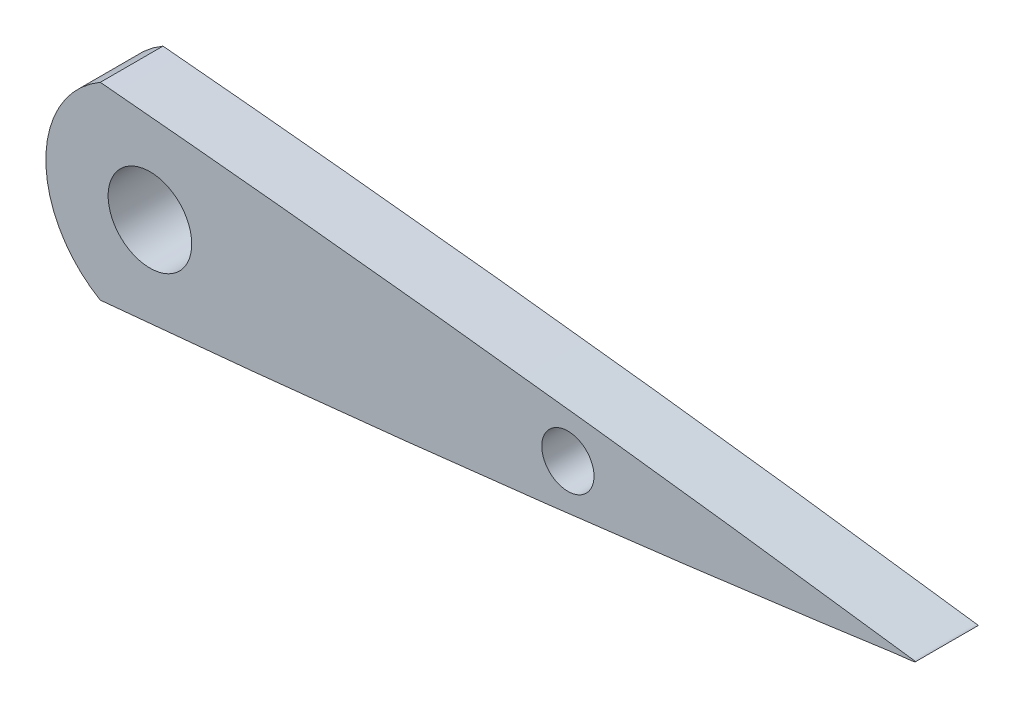
ISO-10303-21;
HEADER;
FILE_DESCRIPTION(('STEP AP214'),'2;1');
FILE_NAME('part.step','',(''),(''),'','','');
FILE_SCHEMA(('AUTOMOTIVE_DESIGN { 1 0 10303 214 1 1 1 1 }'));
ENDSEC;
DATA;
#1=APPLICATION_CONTEXT('core data for automotive mechanical design processes');
#2=APPLICATION_PROTOCOL_DEFINITION('international standard','automotive_design',2000,#1);
#3=PRODUCT_CONTEXT('',#1,'mechanical');
#4=PRODUCT('Part','Part','',(#3));
#5=PRODUCT_RELATED_PRODUCT_CATEGORY('part','',(#4));
#6=PRODUCT_DEFINITION_FORMATION('','',#4);
#7=PRODUCT_DEFINITION_CONTEXT('part definition',#1,'design');
#8=PRODUCT_DEFINITION('design','',#6,#7);
#9=PRODUCT_DEFINITION_SHAPE('','',#8);
#10=(LENGTH_UNIT() NAMED_UNIT(*) SI_UNIT(.MILLI.,.METRE.));
#11=(NAMED_UNIT(*) PLANE_ANGLE_UNIT() SI_UNIT($,.RADIAN.));
#12=(NAMED_UNIT(*) SI_UNIT($,.STERADIAN.) SOLID_ANGLE_UNIT());
#13=UNCERTAINTY_MEASURE_WITH_UNIT(LENGTH_MEASURE(1.E-05),#10,'distance_accuracy_value','');
#14=(GEOMETRIC_REPRESENTATION_CONTEXT(3) GLOBAL_UNCERTAINTY_ASSIGNED_CONTEXT((#13)) GLOBAL_UNIT_ASSIGNED_CONTEXT((#10,
#11,#12)) REPRESENTATION_CONTEXT('',''));
#15=CARTESIAN_POINT('',(0.,0.,0.));
#16=DIRECTION('',(0.,0.,1.));
#17=DIRECTION('',(1.,0.,0.));
#18=AXIS2_PLACEMENT_3D('',#15,#16,#17);
#19=CARTESIAN_POINT('',(152.202991408779,0.,6.));
#20=DIRECTION('',(0.,0.,-1.));
#21=DIRECTION('',(-1.,0.,0.));
#22=AXIS2_PLACEMENT_3D('',#19,#20,#21);
#23=CYLINDRICAL_SURFACE('',#22,10.4259828175577);
#24=CARTESIAN_POINT('',(152.202991408779,0.,0.));
#25=DIRECTION('',(0.,0.,1.));
#26=DIRECTION('',(1.,0.,0.));
#27=AXIS2_PLACEMENT_3D('',#24,#25,#26);
#28=CIRCLE('',#27,10.4259828175577);
#29=CARTESIAN_POINT('',(146.99,9.02916597942501,0.));
#30=VERTEX_POINT('',#29);
#31=CARTESIAN_POINT('',(146.99,-9.02916597942503,0.));
#32=VERTEX_POINT('',#31);
#33=EDGE_CURVE('E67',#30,#32,#28,.T.);
#34=ORIENTED_EDGE('',*,*,#33,.T.);
#35=DIRECTION('',(0.,0.,-1.));
#36=VECTOR('',#35,1.);
#37=CARTESIAN_POINT('',(146.99,-9.02916597942503,6.));
#38=LINE('',#37,#36);
#39=CARTESIAN_POINT('',(146.99,-9.02916597942503,6.));
#40=VERTEX_POINT('',#39);
#41=EDGE_CURVE('E11',#40,#32,#38,.T.);
#42=ORIENTED_EDGE('',*,*,#41,.F.);
#43=CARTESIAN_POINT('',(152.202991408779,0.,6.));
#44=DIRECTION('',(0.,0.,1.));
#45=DIRECTION('',(1.,0.,0.));
#46=AXIS2_PLACEMENT_3D('',#43,#44,#45);
#47=CIRCLE('',#46,10.4259828175577);
#48=CARTESIAN_POINT('',(146.99,9.02916597942501,6.));
#49=VERTEX_POINT('',#48);
#50=EDGE_CURVE('E70',#49,#40,#47,.T.);
#51=ORIENTED_EDGE('',*,*,#50,.F.);
#52=DIRECTION('',(0.,0.,-1.));
#53=VECTOR('',#52,1.);
#54=CARTESIAN_POINT('',(146.99,9.02916597942501,6.));
#55=LINE('',#54,#53);
#56=EDGE_CURVE('E44',#49,#30,#55,.T.);
#57=ORIENTED_EDGE('',*,*,#56,.T.);
#58=EDGE_LOOP('',(#34,#42,#51,#57));
#59=FACE_BOUND('',#58,.T.);
#60=ADVANCED_FACE('F35',(#59),#23,.T.);
#61=CARTESIAN_POINT('',(191.74,0.,6.));
#62=DIRECTION('',(0.,0.,-1.));
#63=DIRECTION('',(-1.,0.,0.));
#64=AXIS2_PLACEMENT_3D('',#61,#62,#63);
#65=CYLINDRICAL_SURFACE('',#64,2.5);
#66=CARTESIAN_POINT('',(191.74,0.,6.));
#67=DIRECTION('',(0.,0.,1.));
#68=DIRECTION('',(1.,0.,0.));
#69=AXIS2_PLACEMENT_3D('',#66,#67,#68);
#70=CIRCLE('',#69,2.5);
#71=CARTESIAN_POINT('',(194.24,0.,6.));
#72=VERTEX_POINT('',#71);
#73=EDGE_CURVE('E119',#72,#72,#70,.T.);
#74=ORIENTED_EDGE('',*,*,#73,.T.);
#75=EDGE_LOOP('',(#74));
#76=FACE_BOUND('',#75,.T.);
#77=CARTESIAN_POINT('',(191.74,0.,0.));
#78=DIRECTION('',(0.,0.,1.));
#79=DIRECTION('',(1.,0.,0.));
#80=AXIS2_PLACEMENT_3D('',#77,#78,#79);
#81=CIRCLE('',#80,2.5);
#82=CARTESIAN_POINT('',(194.24,0.,0.));
#83=VERTEX_POINT('',#82);
#84=EDGE_CURVE('E72',#83,#83,#81,.T.);
#85=ORIENTED_EDGE('',*,*,#84,.F.);
#86=EDGE_LOOP('',(#85));
#87=FACE_BOUND('',#86,.T.);
#88=ADVANCED_FACE('F99',(#76,#87),#65,.F.);
#89=CARTESIAN_POINT('',(151.74,0.,6.));
#90=DIRECTION('',(0.,0.,-1.));
#91=DIRECTION('',(-1.,0.,0.));
#92=AXIS2_PLACEMENT_3D('',#89,#90,#91);
#93=CYLINDRICAL_SURFACE('',#92,3.99999999999999);
#94=CARTESIAN_POINT('',(151.74,0.,6.));
#95=DIRECTION('',(0.,0.,1.));
#96=DIRECTION('',(1.,0.,0.));
#97=AXIS2_PLACEMENT_3D('',#94,#95,#96);
#98=CIRCLE('',#97,3.99999999999999);
#99=CARTESIAN_POINT('',(155.74,0.,6.));
#100=VERTEX_POINT('',#99);
#101=EDGE_CURVE('E66',#100,#100,#98,.T.);
#102=ORIENTED_EDGE('',*,*,#101,.T.);
#103=EDGE_LOOP('',(#102));
#104=FACE_BOUND('',#103,.T.);
#105=CARTESIAN_POINT('',(151.74,0.,0.));
#106=DIRECTION('',(0.,0.,1.));
#107=DIRECTION('',(1.,0.,0.));
#108=AXIS2_PLACEMENT_3D('',#105,#106,#107);
#109=CIRCLE('',#108,3.99999999999999);
#110=CARTESIAN_POINT('',(155.74,0.,0.));
#111=VERTEX_POINT('',#110);
#112=EDGE_CURVE('E75',#111,#111,#109,.T.);
#113=ORIENTED_EDGE('',*,*,#112,.F.);
#114=EDGE_LOOP('',(#113));
#115=FACE_BOUND('',#114,.T.);
#116=ADVANCED_FACE('F37',(#104,#115),#93,.F.);
#117=CARTESIAN_POINT('',(224.99,0.,6.));
#118=CARTESIAN_POINT('',(224.99,0.0936399089460293,6.));
#119=CARTESIAN_POINT('',(223.595746130616,0.193373845542103,6.));
#120=CARTESIAN_POINT('',(222.774416409218,0.311430202621291,6.));
#121=CARTESIAN_POINT('',(222.380592331703,0.365976444931386,6.));
#122=CARTESIAN_POINT('',(221.733815917181,0.456686871044343,6.));
#123=CARTESIAN_POINT('',(220.826456392469,0.582872783366825,6.));
#124=CARTESIAN_POINT('',(219.665029798501,0.743094035209075,6.));
#125=CARTESIAN_POINT('',(218.250549272661,0.937549824602303,6.));
#126=CARTESIAN_POINT('',(216.586842946725,1.16413698530713,6.));
#127=CARTESIAN_POINT('',(214.677613989722,1.42138793766242,6.));
#128=CARTESIAN_POINT('',(212.52746436406,1.7082025997467,6.));
#129=CARTESIAN_POINT('',(210.14136537986,2.02252182387601,6.));
#130=CARTESIAN_POINT('',(207.52488501805,2.36286914999636,6.));
#131=CARTESIAN_POINT('',(204.684077394457,2.72651263861311,6.));
#132=CARTESIAN_POINT('',(201.625623904112,3.11253270356046,6.));
#133=CARTESIAN_POINT('',(198.356644788662,3.51822857539544,6.));
#134=CARTESIAN_POINT('',(194.884804674888,3.9415020023849,6.));
#135=CARTESIAN_POINT('',(191.218237662052,4.3804635561405,6.));
#136=CARTESIAN_POINT('',(187.365482473069,4.83281958963657,6.));
#137=CARTESIAN_POINT('',(183.335395872136,5.29586023728934,6.));
#138=CARTESIAN_POINT('',(179.137619623971,5.76840301552684,6.));
#139=CARTESIAN_POINT('',(174.78182601438,6.24705809984863,6.));
#140=CARTESIAN_POINT('',(170.278326288037,6.73053990479514,6.));
#141=CARTESIAN_POINT('',(165.637462145831,7.21539343178369,6.));
#142=CARTESIAN_POINT('',(160.87017310851,7.7007201316154,6.));
#143=CARTESIAN_POINT('',(155.987534715591,8.18277765494636,6.));
#144=CARTESIAN_POINT('',(151.001027479404,8.6600519152972,6.));
#145=CARTESIAN_POINT('',(145.922230926608,9.12922810441266,6.));
#146=CARTESIAN_POINT('',(140.762992684932,9.58877224882131,6.));
#147=CARTESIAN_POINT('',(135.535393921194,10.0348853931963,6.));
#148=CARTESIAN_POINT('',(130.251617051582,10.4655721258037,6.));
#149=CARTESIAN_POINT('',(124.924069363749,10.8780819930925,6.));
#150=CARTESIAN_POINT('',(119.565125585237,11.2691035872348,6.));
#151=CARTESIAN_POINT('',(114.187379478979,11.636184419255,6.));
#152=CARTESIAN_POINT('',(108.803384617595,11.9763923900708,6.));
#153=CARTESIAN_POINT('',(103.425603277321,12.286441797981,6.));
#154=CARTESIAN_POINT('',(98.0666951728999,12.5638808067998,6.));
#155=CARTESIAN_POINT('',(92.7390539454215,12.8056805631628,6.));
#156=CARTESIAN_POINT('',(87.4551660707886,13.0091474557199,6.));
#157=CARTESIAN_POINT('',(82.2274512559409,13.1720225986514,6.));
#158=CARTESIAN_POINT('',(77.0680807412235,13.2914088034542,6.));
#159=CARTESIAN_POINT('',(71.989099485352,13.3652014260259,6.));
#160=CARTESIAN_POINT('',(67.0022460637208,13.3913263726876,6.));
#161=CARTESIAN_POINT('',(62.1192652917784,13.3682312856548,6.));
#162=CARTESIAN_POINT('',(57.3515851820817,13.2948777825989,6.));
#163=CARTESIAN_POINT('',(52.7103779320171,13.1690490518619,6.));
#164=CARTESIAN_POINT('',(48.2063798295924,12.9913019308394,6.));
#165=CARTESIAN_POINT('',(43.8501003602059,12.760359238534,6.));
#166=CARTESIAN_POINT('',(39.6516815030013,12.4768682770992,6.));
#167=CARTESIAN_POINT('',(35.6210095762113,12.1408881809978,6.));
#168=CARTESIAN_POINT('',(31.7674556586821,11.7530295605508,6.));
#169=CARTESIAN_POINT('',(28.0999736008749,11.3147637822395,6.));
#170=CARTESIAN_POINT('',(24.6270183927304,10.8278722456435,6.));
#171=CARTESIAN_POINT('',(21.3567714860386,10.2932625706839,6.));
#172=CARTESIAN_POINT('',(18.2967276666353,9.71360665751105,6.));
#173=CARTESIAN_POINT('',(15.4539295753535,9.09108409030171,6.));
#174=CARTESIAN_POINT('',(12.8350210621173,8.42780515387819,6.));
#175=CARTESIAN_POINT('',(10.4457891007589,7.72674124067484,6.));
#176=CARTESIAN_POINT('',(8.29150194484111,6.99022056753928,6.));
#177=CARTESIAN_POINT('',(6.37675372918266,6.22078692345108,6.));
#178=CARTESIAN_POINT('',(4.70533478343082,5.42065997541944,6.));
#179=CARTESIAN_POINT('',(3.28042937908381,4.59150555076787,6.));
#180=CARTESIAN_POINT('',(2.10369675933993,3.7347292283035,6.));
#181=CARTESIAN_POINT('',(1.17741069124905,2.84892165825551,6.));
#182=CARTESIAN_POINT('',(0.503804938636925,1.93157349618497,6.));
#183=CARTESIAN_POINT('',(0.0919613186022872,0.978200851981239,6.));
#184=CARTESIAN_POINT('',(-0.0448257973070909,0.,6.));
#185=CARTESIAN_POINT('',(0.0919613186022872,-0.97820085198124,6.));
#186=CARTESIAN_POINT('',(0.503804938636925,-1.93157349618497,6.));
#187=CARTESIAN_POINT('',(1.17741069124905,-2.84892165825551,6.));
#188=CARTESIAN_POINT('',(2.10369675933994,-3.73472922830351,6.));
#189=CARTESIAN_POINT('',(3.28042937908379,-4.59150555076786,6.));
#190=CARTESIAN_POINT('',(4.70533478343082,-5.42065997541944,6.));
#191=CARTESIAN_POINT('',(6.37675372918267,-6.22078692345108,6.));
#192=CARTESIAN_POINT('',(8.29150194484108,-6.99022056753927,6.));
#193=CARTESIAN_POINT('',(10.4457891007589,-7.72674124067485,6.));
#194=CARTESIAN_POINT('',(12.8350210621173,-8.42780515387819,6.));
#195=CARTESIAN_POINT('',(15.4539295753536,-9.09108409030172,6.));
#196=CARTESIAN_POINT('',(18.2967276666353,-9.71360665751104,6.));
#197=CARTESIAN_POINT('',(21.3567714860387,-10.293262570684,6.));
#198=CARTESIAN_POINT('',(24.6270183927303,-10.8278722456434,6.));
#199=CARTESIAN_POINT('',(28.099973600875,-11.3147637822395,6.));
#200=CARTESIAN_POINT('',(31.7674556586821,-11.7530295605508,6.));
#201=CARTESIAN_POINT('',(35.6210095762113,-12.1408881809978,6.));
#202=CARTESIAN_POINT('',(39.6516815030013,-12.4768682770992,6.));
#203=CARTESIAN_POINT('',(43.850100360206,-12.760359238534,6.));
#204=CARTESIAN_POINT('',(48.2063798295923,-12.9913019308394,6.));
#205=CARTESIAN_POINT('',(52.7103779320171,-13.1690490518619,6.));
#206=CARTESIAN_POINT('',(57.3515851820817,-13.2948777825989,6.));
#207=CARTESIAN_POINT('',(62.1192652917784,-13.3682312856548,6.));
#208=CARTESIAN_POINT('',(67.0022460637208,-13.3913263726876,6.));
#209=CARTESIAN_POINT('',(71.989099485352,-13.3652014260259,6.));
#210=CARTESIAN_POINT('',(77.0680807412235,-13.2914088034542,6.));
#211=CARTESIAN_POINT('',(82.2274512559409,-13.1720225986514,6.));
#212=CARTESIAN_POINT('',(87.4551660707887,-13.0091474557199,6.));
#213=CARTESIAN_POINT('',(92.7390539454215,-12.8056805631628,6.));
#214=CARTESIAN_POINT('',(98.0666951728998,-12.5638808067998,6.));
#215=CARTESIAN_POINT('',(103.425603277321,-12.286441797981,6.));
#216=CARTESIAN_POINT('',(108.803384617595,-11.9763923900708,6.));
#217=CARTESIAN_POINT('',(114.187379478979,-11.636184419255,6.));
#218=CARTESIAN_POINT('',(119.565125585237,-11.2691035872348,6.));
#219=CARTESIAN_POINT('',(124.924069363749,-10.8780819930925,6.));
#220=CARTESIAN_POINT('',(130.251617051582,-10.4655721258037,6.));
#221=CARTESIAN_POINT('',(135.535393921194,-10.0348853931963,6.));
#222=CARTESIAN_POINT('',(140.762992684932,-9.58877224882131,6.));
#223=CARTESIAN_POINT('',(145.922230926608,-9.12922810441266,6.));
#224=CARTESIAN_POINT('',(151.001027479404,-8.6600519152972,6.));
#225=CARTESIAN_POINT('',(155.987534715591,-8.18277765494636,6.));
#226=CARTESIAN_POINT('',(160.87017310851,-7.7007201316154,6.));
#227=CARTESIAN_POINT('',(165.637462145831,-7.21539343178368,6.));
#228=CARTESIAN_POINT('',(170.278326288036,-6.73053990479514,6.));
#229=CARTESIAN_POINT('',(174.78182601438,-6.24705809984863,6.));
#230=CARTESIAN_POINT('',(179.137619623971,-5.76840301552684,6.));
#231=CARTESIAN_POINT('',(183.335395872136,-5.29586023728934,6.));
#232=CARTESIAN_POINT('',(187.365482473069,-4.83281958963656,6.));
#233=CARTESIAN_POINT('',(191.218237662052,-4.3804635561405,6.));
#234=CARTESIAN_POINT('',(194.884804674888,-3.9415020023849,6.));
#235=CARTESIAN_POINT('',(198.356644788662,-3.51822857539544,6.));
#236=CARTESIAN_POINT('',(201.625623904112,-3.11253270356047,6.));
#237=CARTESIAN_POINT('',(204.684077394458,-2.7265126386131,6.));
#238=CARTESIAN_POINT('',(207.52488501805,-2.36286914999637,6.));
#239=CARTESIAN_POINT('',(210.14136537986,-2.02252182387601,6.));
#240=CARTESIAN_POINT('',(212.52746436406,-1.7082025997467,6.));
#241=CARTESIAN_POINT('',(214.677613989722,-1.42138793766242,6.));
#242=CARTESIAN_POINT('',(216.586842946725,-1.16413698530713,6.));
#243=CARTESIAN_POINT('',(218.250549272661,-0.937549824602305,6.));
#244=CARTESIAN_POINT('',(219.665029798501,-0.743094035209075,6.));
#245=CARTESIAN_POINT('',(220.826456392469,-0.582872783366825,6.));
#246=CARTESIAN_POINT('',(221.733815917181,-0.456686871044347,6.));
#247=CARTESIAN_POINT('',(222.380592331704,-0.365976444931376,6.));
#248=CARTESIAN_POINT('',(222.774416409218,-0.3114302026213,6.));
#249=CARTESIAN_POINT('',(223.595746130616,-0.193373845542074,6.));
#250=CARTESIAN_POINT('',(224.99,-0.093639908946028,6.));
#251=CARTESIAN_POINT('',(224.99,0.,6.));
#252=B_SPLINE_CURVE_WITH_KNOTS('',3,(#117,#118,#119,#120,#121,#122,#123,#124,#125,#126,#127,
#128,#129,#130,#131,#132,#133,#134,#135,#136,#137,#138,#139,#140,#141,#142,#143,#144,#145,#146,
#147,#148,#149,#150,#151,#152,#153,#154,#155,#156,#157,#158,#159,#160,#161,#162,#163,#164,#165,
#166,#167,#168,#169,#170,#171,#172,#173,#174,#175,#176,#177,#178,#179,#180,#181,#182,#183,#184,
#185,#186,#187,#188,#189,#190,#191,#192,#193,#194,#195,#196,#197,#198,#199,#200,#201,#202,#203,
#204,#205,#206,#207,#208,#209,#210,#211,#212,#213,#214,#215,#216,#217,#218,#219,#220,#221,#222,
#223,#224,#225,#226,#227,#228,#229,#230,#231,#232,#233,#234,#235,#236,#237,#238,#239,#240,#241,
#242,#243,#244,#245,#246,#247,#248,#249,#250,#251),.UNSPECIFIED.,.T.,.F.,(4,1,1,1,1,1,1,1,1,1,1,
1,1,1,1,1,1,1,1,1,1,1,1,1,1,1,1,1,1,1,1,1,1,1,1,1,1,1,1,1,1,1,1,1,1,1,1,1,1,1,1,1,1,1,1,1,1,1,1,
1,1,1,1,1,1,1,1,1,1,1,1,1,1,1,1,1,1,1,1,1,1,1,1,1,1,1,1,1,1,1,1,1,1,1,1,1,1,1,1,1,1,1,1,1,1,1,1,
1,1,1,1,1,1,1,1,1,1,1,1,1,1,1,1,1,1,1,1,1,1,1,1,1,4),(0.,0.00440467879848221,
0.00469133258413391,0.00555026344881907,0.00697995985799667,0.00897636963796533,0.0115348260567,
0.0146494200161432,0.0183124682677628,0.0225153297967714,0.0272475071511949,0.0324978969888315,
0.0382539577736297,0.0445020673100027,0.0512268692914236,0.0584133135335328,0.0660434673423194,
0.0740989843094176,0.0825619521418424,0.0914115187714455,0.100627009094653,0.110186574535165,
0.120067574978576,0.130246743067928,0.14070054663829,0.151404252220162,0.162331842123756,
0.173458675433253,0.184758289852552,0.196204076021642,0.207768617639119,0.219425944893927,
0.23114763501964,0.24290635936924,0.254675296330742,0.266426209687603,0.278132454903868,
0.289766476738527,0.301301813960829,0.312711645888378,0.323969258958743,0.335050049682473,
0.345928598543255,0.356580621254698,0.36698199611427,0.377109775970705,0.38694211876938,
0.396457905017652,0.405636644878595,0.414459070097741,0.422906620432419,0.430962851264248,
0.438611617885941,0.445838274990754,0.452630376820439,0.458976172582132,0.464866300146481,
0.470293867968779,0.475254828842582,0.47974912423313,0.483781005918072,0.487362579764819,
0.490515631726195,0.493278565847177,0.495712194394319,0.497909944008049,0.5,0.502090055991951,
0.504287805605681,0.506721434152823,0.509484368273805,0.512637420235181,0.516218994081928,
0.52025087576687,0.524745171157418,0.529706132031221,0.535133699853519,0.541023827417868,
0.547369623179561,0.554161725009246,0.561388382114059,0.569037148735752,0.577093379567581,
0.585540929902259,0.594363355121405,0.603542094982348,0.61305788123062,0.622890224029295,
0.63301800388573,0.643419378745302,0.654071401456745,0.664949950317527,0.676030741041257,
0.687288354111622,0.698698186039171,0.710233523261473,0.721867545096132,0.733573790312397,
0.745324703669258,0.75709364063076,0.76885236498036,0.780574055106073,0.792231382360881,
0.803795923978359,0.815241710147449,0.826541324566748,0.837668157876244,0.848595747779838,
0.85929945336171,0.869753256932072,0.879932425021424,0.889813425464835,0.899372990905347,
0.908588481228555,0.917438047858158,0.925901015690583,0.933956532657681,0.941586686466467,
0.948773130708577,0.955497932689997,0.961746042226371,0.967502103011169,0.972752492848805,
0.977484670203229,0.981687531732237,0.985350579983857,0.9884651739433,0.991023630362035,
0.993020040142003,0.994449736551181,0.995308667415866,0.995595321201518,1.),.UNSPECIFIED.);
#253=DIRECTION('',(0.,0.,-1.));
#254=VECTOR('',#253,1.);
#255=SURFACE_OF_LINEAR_EXTRUSION('',#252,#254);
#256=CARTESIAN_POINT('',(224.99,0.,0.));
#257=CARTESIAN_POINT('',(224.99,0.0936399089460293,0.));
#258=CARTESIAN_POINT('',(223.595746130616,0.193373845542103,0.));
#259=CARTESIAN_POINT('',(222.774416409218,0.311430202621291,0.));
#260=CARTESIAN_POINT('',(222.380592331703,0.365976444931386,0.));
#261=CARTESIAN_POINT('',(221.733815917181,0.456686871044343,0.));
#262=CARTESIAN_POINT('',(220.826456392469,0.582872783366825,0.));
#263=CARTESIAN_POINT('',(219.665029798501,0.743094035209075,0.));
#264=CARTESIAN_POINT('',(218.250549272661,0.937549824602303,0.));
#265=CARTESIAN_POINT('',(216.586842946725,1.16413698530713,0.));
#266=CARTESIAN_POINT('',(214.677613989722,1.42138793766242,0.));
#267=CARTESIAN_POINT('',(212.52746436406,1.7082025997467,0.));
#268=CARTESIAN_POINT('',(210.14136537986,2.02252182387601,0.));
#269=CARTESIAN_POINT('',(207.52488501805,2.36286914999636,0.));
#270=CARTESIAN_POINT('',(204.684077394457,2.72651263861311,0.));
#271=CARTESIAN_POINT('',(201.625623904112,3.11253270356046,0.));
#272=CARTESIAN_POINT('',(198.356644788662,3.51822857539544,0.));
#273=CARTESIAN_POINT('',(194.884804674888,3.9415020023849,0.));
#274=CARTESIAN_POINT('',(191.218237662052,4.3804635561405,0.));
#275=CARTESIAN_POINT('',(187.365482473069,4.83281958963657,0.));
#276=CARTESIAN_POINT('',(183.335395872136,5.29586023728934,0.));
#277=CARTESIAN_POINT('',(179.137619623971,5.76840301552684,0.));
#278=CARTESIAN_POINT('',(174.78182601438,6.24705809984863,0.));
#279=CARTESIAN_POINT('',(170.278326288037,6.73053990479514,0.));
#280=CARTESIAN_POINT('',(165.637462145831,7.21539343178369,0.));
#281=CARTESIAN_POINT('',(160.87017310851,7.7007201316154,0.));
#282=CARTESIAN_POINT('',(155.987534715591,8.18277765494636,0.));
#283=CARTESIAN_POINT('',(151.001027479404,8.6600519152972,0.));
#284=CARTESIAN_POINT('',(145.922230926608,9.12922810441266,0.));
#285=CARTESIAN_POINT('',(140.762992684932,9.58877224882131,0.));
#286=CARTESIAN_POINT('',(135.535393921194,10.0348853931963,0.));
#287=CARTESIAN_POINT('',(130.251617051582,10.4655721258037,0.));
#288=CARTESIAN_POINT('',(124.924069363749,10.8780819930925,0.));
#289=CARTESIAN_POINT('',(119.565125585237,11.2691035872348,0.));
#290=CARTESIAN_POINT('',(114.187379478979,11.636184419255,0.));
#291=CARTESIAN_POINT('',(108.803384617595,11.9763923900708,0.));
#292=CARTESIAN_POINT('',(103.425603277321,12.286441797981,0.));
#293=CARTESIAN_POINT('',(98.0666951728999,12.5638808067998,0.));
#294=CARTESIAN_POINT('',(92.7390539454215,12.8056805631628,0.));
#295=CARTESIAN_POINT('',(87.4551660707886,13.0091474557199,0.));
#296=CARTESIAN_POINT('',(82.2274512559409,13.1720225986514,0.));
#297=CARTESIAN_POINT('',(77.0680807412235,13.2914088034542,0.));
#298=CARTESIAN_POINT('',(71.989099485352,13.3652014260259,0.));
#299=CARTESIAN_POINT('',(67.0022460637208,13.3913263726876,0.));
#300=CARTESIAN_POINT('',(62.1192652917784,13.3682312856548,0.));
#301=CARTESIAN_POINT('',(57.3515851820817,13.2948777825989,0.));
#302=CARTESIAN_POINT('',(52.7103779320171,13.1690490518619,0.));
#303=CARTESIAN_POINT('',(48.2063798295924,12.9913019308394,0.));
#304=CARTESIAN_POINT('',(43.8501003602059,12.760359238534,0.));
#305=CARTESIAN_POINT('',(39.6516815030013,12.4768682770992,0.));
#306=CARTESIAN_POINT('',(35.6210095762113,12.1408881809978,0.));
#307=CARTESIAN_POINT('',(31.7674556586821,11.7530295605508,0.));
#308=CARTESIAN_POINT('',(28.0999736008749,11.3147637822395,0.));
#309=CARTESIAN_POINT('',(24.6270183927304,10.8278722456435,0.));
#310=CARTESIAN_POINT('',(21.3567714860386,10.2932625706839,0.));
#311=CARTESIAN_POINT('',(18.2967276666353,9.71360665751105,0.));
#312=CARTESIAN_POINT('',(15.4539295753535,9.09108409030171,0.));
#313=CARTESIAN_POINT('',(12.8350210621173,8.42780515387819,0.));
#314=CARTESIAN_POINT('',(10.4457891007589,7.72674124067484,0.));
#315=CARTESIAN_POINT('',(8.29150194484111,6.99022056753928,0.));
#316=CARTESIAN_POINT('',(6.37675372918266,6.22078692345108,0.));
#317=CARTESIAN_POINT('',(4.70533478343082,5.42065997541944,0.));
#318=CARTESIAN_POINT('',(3.28042937908381,4.59150555076787,0.));
#319=CARTESIAN_POINT('',(2.10369675933993,3.7347292283035,0.));
#320=CARTESIAN_POINT('',(1.17741069124905,2.84892165825551,0.));
#321=CARTESIAN_POINT('',(0.503804938636925,1.93157349618497,0.));
#322=CARTESIAN_POINT('',(0.0919613186022872,0.978200851981239,0.));
#323=CARTESIAN_POINT('',(-0.0448257973070909,0.,0.));
#324=CARTESIAN_POINT('',(0.0919613186022872,-0.97820085198124,0.));
#325=CARTESIAN_POINT('',(0.503804938636925,-1.93157349618497,0.));
#326=CARTESIAN_POINT('',(1.17741069124905,-2.84892165825551,0.));
#327=CARTESIAN_POINT('',(2.10369675933994,-3.73472922830351,0.));
#328=CARTESIAN_POINT('',(3.28042937908379,-4.59150555076786,0.));
#329=CARTESIAN_POINT('',(4.70533478343082,-5.42065997541944,0.));
#330=CARTESIAN_POINT('',(6.37675372918267,-6.22078692345108,0.));
#331=CARTESIAN_POINT('',(8.29150194484108,-6.99022056753927,0.));
#332=CARTESIAN_POINT('',(10.4457891007589,-7.72674124067485,0.));
#333=CARTESIAN_POINT('',(12.8350210621173,-8.42780515387819,0.));
#334=CARTESIAN_POINT('',(15.4539295753536,-9.09108409030172,0.));
#335=CARTESIAN_POINT('',(18.2967276666353,-9.71360665751104,0.));
#336=CARTESIAN_POINT('',(21.3567714860387,-10.293262570684,0.));
#337=CARTESIAN_POINT('',(24.6270183927303,-10.8278722456434,0.));
#338=CARTESIAN_POINT('',(28.099973600875,-11.3147637822395,0.));
#339=CARTESIAN_POINT('',(31.7674556586821,-11.7530295605508,0.));
#340=CARTESIAN_POINT('',(35.6210095762113,-12.1408881809978,0.));
#341=CARTESIAN_POINT('',(39.6516815030013,-12.4768682770992,0.));
#342=CARTESIAN_POINT('',(43.850100360206,-12.760359238534,0.));
#343=CARTESIAN_POINT('',(48.2063798295923,-12.9913019308394,0.));
#344=CARTESIAN_POINT('',(52.7103779320171,-13.1690490518619,0.));
#345=CARTESIAN_POINT('',(57.3515851820817,-13.2948777825989,0.));
#346=CARTESIAN_POINT('',(62.1192652917784,-13.3682312856548,0.));
#347=CARTESIAN_POINT('',(67.0022460637208,-13.3913263726876,0.));
#348=CARTESIAN_POINT('',(71.989099485352,-13.3652014260259,0.));
#349=CARTESIAN_POINT('',(77.0680807412235,-13.2914088034542,0.));
#350=CARTESIAN_POINT('',(82.2274512559409,-13.1720225986514,0.));
#351=CARTESIAN_POINT('',(87.4551660707887,-13.0091474557199,0.));
#352=CARTESIAN_POINT('',(92.7390539454215,-12.8056805631628,0.));
#353=CARTESIAN_POINT('',(98.0666951728998,-12.5638808067998,0.));
#354=CARTESIAN_POINT('',(103.425603277321,-12.286441797981,0.));
#355=CARTESIAN_POINT('',(108.803384617595,-11.9763923900708,0.));
#356=CARTESIAN_POINT('',(114.187379478979,-11.636184419255,0.));
#357=CARTESIAN_POINT('',(119.565125585237,-11.2691035872348,0.));
#358=CARTESIAN_POINT('',(124.924069363749,-10.8780819930925,0.));
#359=CARTESIAN_POINT('',(130.251617051582,-10.4655721258037,0.));
#360=CARTESIAN_POINT('',(135.535393921194,-10.0348853931963,0.));
#361=CARTESIAN_POINT('',(140.762992684932,-9.58877224882131,0.));
#362=CARTESIAN_POINT('',(145.922230926608,-9.12922810441266,0.));
#363=CARTESIAN_POINT('',(151.001027479404,-8.6600519152972,0.));
#364=CARTESIAN_POINT('',(155.987534715591,-8.18277765494636,0.));
#365=CARTESIAN_POINT('',(160.87017310851,-7.7007201316154,0.));
#366=CARTESIAN_POINT('',(165.637462145831,-7.21539343178368,0.));
#367=CARTESIAN_POINT('',(170.278326288036,-6.73053990479514,0.));
#368=CARTESIAN_POINT('',(174.78182601438,-6.24705809984863,0.));
#369=CARTESIAN_POINT('',(179.137619623971,-5.76840301552684,0.));
#370=CARTESIAN_POINT('',(183.335395872136,-5.29586023728934,0.));
#371=CARTESIAN_POINT('',(187.365482473069,-4.83281958963656,0.));
#372=CARTESIAN_POINT('',(191.218237662052,-4.3804635561405,0.));
#373=CARTESIAN_POINT('',(194.884804674888,-3.9415020023849,0.));
#374=CARTESIAN_POINT('',(198.356644788662,-3.51822857539544,0.));
#375=CARTESIAN_POINT('',(201.625623904112,-3.11253270356047,0.));
#376=CARTESIAN_POINT('',(204.684077394458,-2.7265126386131,0.));
#377=CARTESIAN_POINT('',(207.52488501805,-2.36286914999637,0.));
#378=CARTESIAN_POINT('',(210.14136537986,-2.02252182387601,0.));
#379=CARTESIAN_POINT('',(212.52746436406,-1.7082025997467,0.));
#380=CARTESIAN_POINT('',(214.677613989722,-1.42138793766242,0.));
#381=CARTESIAN_POINT('',(216.586842946725,-1.16413698530713,0.));
#382=CARTESIAN_POINT('',(218.250549272661,-0.937549824602305,0.));
#383=CARTESIAN_POINT('',(219.665029798501,-0.743094035209075,0.));
#384=CARTESIAN_POINT('',(220.826456392469,-0.582872783366825,0.));
#385=CARTESIAN_POINT('',(221.733815917181,-0.456686871044347,0.));
#386=CARTESIAN_POINT('',(222.380592331704,-0.365976444931376,0.));
#387=CARTESIAN_POINT('',(222.774416409218,-0.3114302026213,0.));
#388=CARTESIAN_POINT('',(223.595746130616,-0.193373845542074,0.));
#389=CARTESIAN_POINT('',(224.99,-0.093639908946028,0.));
#390=CARTESIAN_POINT('',(224.99,0.,0.));
#391=B_SPLINE_CURVE_WITH_KNOTS('',3,(#256,#257,#258,#259,#260,#261,#262,#263,#264,#265,#266,
#267,#268,#269,#270,#271,#272,#273,#274,#275,#276,#277,#278,#279,#280,#281,#282,#283,#284,#285,
#286,#287,#288,#289,#290,#291,#292,#293,#294,#295,#296,#297,#298,#299,#300,#301,#302,#303,#304,
#305,#306,#307,#308,#309,#310,#311,#312,#313,#314,#315,#316,#317,#318,#319,#320,#321,#322,#323,
#324,#325,#326,#327,#328,#329,#330,#331,#332,#333,#334,#335,#336,#337,#338,#339,#340,#341,#342,
#343,#344,#345,#346,#347,#348,#349,#350,#351,#352,#353,#354,#355,#356,#357,#358,#359,#360,#361,
#362,#363,#364,#365,#366,#367,#368,#369,#370,#371,#372,#373,#374,#375,#376,#377,#378,#379,#380,
#381,#382,#383,#384,#385,#386,#387,#388,#389,#390),.UNSPECIFIED.,.T.,.F.,(4,1,1,1,1,1,1,1,1,1,1,
1,1,1,1,1,1,1,1,1,1,1,1,1,1,1,1,1,1,1,1,1,1,1,1,1,1,1,1,1,1,1,1,1,1,1,1,1,1,1,1,1,1,1,1,1,1,1,1,
1,1,1,1,1,1,1,1,1,1,1,1,1,1,1,1,1,1,1,1,1,1,1,1,1,1,1,1,1,1,1,1,1,1,1,1,1,1,1,1,1,1,1,1,1,1,1,1,
1,1,1,1,1,1,1,1,1,1,1,1,1,1,1,1,1,1,1,1,1,1,1,1,1,4),(0.,0.00440467879848221,
0.00469133258413391,0.00555026344881907,0.00697995985799667,0.00897636963796533,0.0115348260567,
0.0146494200161432,0.0183124682677628,0.0225153297967714,0.0272475071511949,0.0324978969888315,
0.0382539577736297,0.0445020673100027,0.0512268692914236,0.0584133135335328,0.0660434673423194,
0.0740989843094176,0.0825619521418424,0.0914115187714455,0.100627009094653,0.110186574535165,
0.120067574978576,0.130246743067928,0.14070054663829,0.151404252220162,0.162331842123756,
0.173458675433253,0.184758289852552,0.196204076021642,0.207768617639119,0.219425944893927,
0.23114763501964,0.24290635936924,0.254675296330742,0.266426209687603,0.278132454903868,
0.289766476738527,0.301301813960829,0.312711645888378,0.323969258958743,0.335050049682473,
0.345928598543255,0.356580621254698,0.36698199611427,0.377109775970705,0.38694211876938,
0.396457905017652,0.405636644878595,0.414459070097741,0.422906620432419,0.430962851264248,
0.438611617885941,0.445838274990754,0.452630376820439,0.458976172582132,0.464866300146481,
0.470293867968779,0.475254828842582,0.47974912423313,0.483781005918072,0.487362579764819,
0.490515631726195,0.493278565847177,0.495712194394319,0.497909944008049,0.5,0.502090055991951,
0.504287805605681,0.506721434152823,0.509484368273805,0.512637420235181,0.516218994081928,
0.52025087576687,0.524745171157418,0.529706132031221,0.535133699853519,0.541023827417868,
0.547369623179561,0.554161725009246,0.561388382114059,0.569037148735752,0.577093379567581,
0.585540929902259,0.594363355121405,0.603542094982348,0.61305788123062,0.622890224029295,
0.63301800388573,0.643419378745302,0.654071401456745,0.664949950317527,0.676030741041257,
0.687288354111622,0.698698186039171,0.710233523261473,0.721867545096132,0.733573790312397,
0.745324703669258,0.75709364063076,0.76885236498036,0.780574055106073,0.792231382360881,
0.803795923978359,0.815241710147449,0.826541324566748,0.837668157876244,0.848595747779838,
0.85929945336171,0.869753256932072,0.879932425021424,0.889813425464835,0.899372990905347,
0.908588481228555,0.917438047858158,0.925901015690583,0.933956532657681,0.941586686466467,
0.948773130708577,0.955497932689997,0.961746042226371,0.967502103011169,0.972752492848805,
0.977484670203229,0.981687531732237,0.985350579983857,0.9884651739433,0.991023630362035,
0.993020040142003,0.994449736551181,0.995308667415866,0.995595321201518,1.),.UNSPECIFIED.);
#392=EDGE_CURVE('E59',#32,#30,#391,.T.);
#393=ORIENTED_EDGE('',*,*,#392,.T.);
#394=ORIENTED_EDGE('',*,*,#56,.F.);
#395=EDGE_CURVE('E51',#40,#49,#252,.T.);
#396=ORIENTED_EDGE('',*,*,#395,.F.);
#397=ORIENTED_EDGE('',*,*,#41,.T.);
#398=EDGE_LOOP('',(#393,#394,#396,#397));
#399=FACE_BOUND('',#398,.T.);
#400=ADVANCED_FACE('F62',(#399),#255,.F.);
#401=CARTESIAN_POINT('',(0.,0.,0.));
#402=DIRECTION('',(0.,0.,1.));
#403=DIRECTION('',(1.,0.,0.));
#404=AXIS2_PLACEMENT_3D('',#401,#402,#403);
#405=PLANE('',#404);
#406=ORIENTED_EDGE('',*,*,#112,.T.);
#407=EDGE_LOOP('',(#406));
#408=FACE_BOUND('',#407,.T.);
#409=ORIENTED_EDGE('',*,*,#84,.T.);
#410=EDGE_LOOP('',(#409));
#411=FACE_BOUND('',#410,.T.);
#412=ORIENTED_EDGE('',*,*,#33,.F.);
#413=ORIENTED_EDGE('',*,*,#392,.F.);
#414=EDGE_LOOP('',(#412,#413));
#415=FACE_BOUND('',#414,.T.);
#416=ADVANCED_FACE('F71',(#408,#411,#415),#405,.F.);
#417=CARTESIAN_POINT('',(0.,0.,6.));
#418=DIRECTION('',(0.,0.,1.));
#419=DIRECTION('',(1.,0.,0.));
#420=AXIS2_PLACEMENT_3D('',#417,#418,#419);
#421=PLANE('',#420);
#422=ORIENTED_EDGE('',*,*,#101,.F.);
#423=EDGE_LOOP('',(#422));
#424=FACE_BOUND('',#423,.T.);
#425=ORIENTED_EDGE('',*,*,#73,.F.);
#426=EDGE_LOOP('',(#425));
#427=FACE_BOUND('',#426,.T.);
#428=ORIENTED_EDGE('',*,*,#50,.T.);
#429=ORIENTED_EDGE('',*,*,#395,.T.);
#430=EDGE_LOOP('',(#428,#429));
#431=FACE_BOUND('',#430,.T.);
#432=ADVANCED_FACE('F100',(#424,#427,#431),#421,.T.);
#433=CLOSED_SHELL('',(#60,#88,#116,#400,#416,#432));
#434=MANIFOLD_SOLID_BREP('B2',#433);
#435=ADVANCED_BREP_SHAPE_REPRESENTATION('',(#18,#434),#14);
#436=SHAPE_DEFINITION_REPRESENTATION(#9,#435);
ENDSEC;
END-ISO-10303-21;
